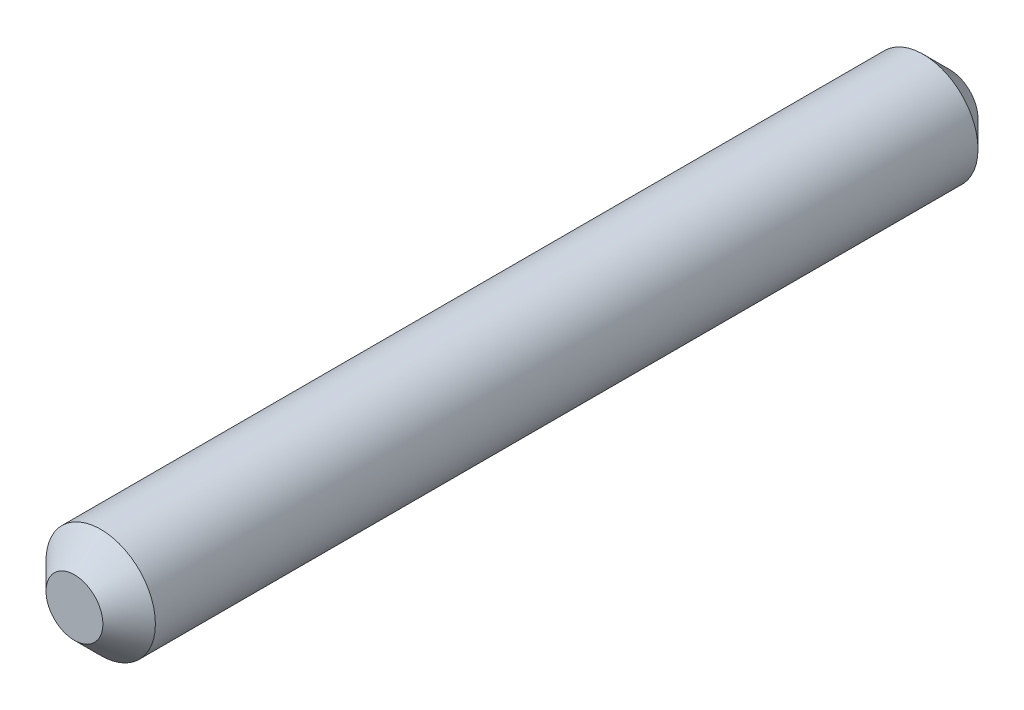
ISO-10303-21;
HEADER;
FILE_DESCRIPTION(('STEP AP214'),'2;1');
FILE_NAME('part.step','',(''),(''),'','','');
FILE_SCHEMA(('AUTOMOTIVE_DESIGN { 1 0 10303 214 1 1 1 1 }'));
ENDSEC;
DATA;
#1=APPLICATION_CONTEXT('core data for automotive mechanical design processes');
#2=APPLICATION_PROTOCOL_DEFINITION('international standard','automotive_design',2000,#1);
#3=PRODUCT_CONTEXT('',#1,'mechanical');
#4=PRODUCT('Part','Part','',(#3));
#5=PRODUCT_RELATED_PRODUCT_CATEGORY('part','',(#4));
#6=PRODUCT_DEFINITION_FORMATION('','',#4);
#7=PRODUCT_DEFINITION_CONTEXT('part definition',#1,'design');
#8=PRODUCT_DEFINITION('design','',#6,#7);
#9=PRODUCT_DEFINITION_SHAPE('','',#8);
#10=(LENGTH_UNIT() NAMED_UNIT(*) SI_UNIT(.MILLI.,.METRE.));
#11=(NAMED_UNIT(*) PLANE_ANGLE_UNIT() SI_UNIT($,.RADIAN.));
#12=(NAMED_UNIT(*) SI_UNIT($,.STERADIAN.) SOLID_ANGLE_UNIT());
#13=UNCERTAINTY_MEASURE_WITH_UNIT(LENGTH_MEASURE(1.E-05),#10,'distance_accuracy_value','');
#14=(GEOMETRIC_REPRESENTATION_CONTEXT(3) GLOBAL_UNCERTAINTY_ASSIGNED_CONTEXT((#13)) GLOBAL_UNIT_ASSIGNED_CONTEXT((#10,
#11,#12)) REPRESENTATION_CONTEXT('',''));
#15=CARTESIAN_POINT('',(0.,0.,0.));
#16=DIRECTION('',(0.,0.,1.));
#17=DIRECTION('',(1.,0.,0.));
#18=AXIS2_PLACEMENT_3D('',#15,#16,#17);
#19=CARTESIAN_POINT('',(0.,0.,25.4));
#20=DIRECTION('',(0.,0.,-1.));
#21=DIRECTION('',(-1.,0.,0.));
#22=AXIS2_PLACEMENT_3D('',#19,#20,#21);
#23=CYLINDRICAL_SURFACE('',#22,1.5875);
#24=CARTESIAN_POINT('',(0.,0.,24.638));
#25=DIRECTION('',(0.,0.,1.));
#26=DIRECTION('',(1.,0.,0.));
#27=AXIS2_PLACEMENT_3D('',#24,#25,#26);
#28=CIRCLE('',#27,1.5875);
#29=CARTESIAN_POINT('',(1.5875,0.,24.638));
#30=VERTEX_POINT('',#29);
#31=EDGE_CURVE('E52',#30,#30,#28,.F.);
#32=ORIENTED_EDGE('',*,*,#31,.T.);
#33=EDGE_LOOP('',(#32));
#34=FACE_BOUND('',#33,.T.);
#35=CARTESIAN_POINT('',(0.,0.,0.762000000000006));
#36=DIRECTION('',(0.,0.,1.));
#37=DIRECTION('',(1.,0.,0.));
#38=AXIS2_PLACEMENT_3D('',#35,#36,#37);
#39=CIRCLE('',#38,1.5875);
#40=CARTESIAN_POINT('',(1.5875,0.,0.762000000000006));
#41=VERTEX_POINT('',#40);
#42=EDGE_CURVE('E57',#41,#41,#39,.T.);
#43=ORIENTED_EDGE('',*,*,#42,.T.);
#44=EDGE_LOOP('',(#43));
#45=FACE_BOUND('',#44,.T.);
#46=ADVANCED_FACE('F43',(#34,#45),#23,.T.);
#47=CARTESIAN_POINT('',(0.,0.,25.4));
#48=DIRECTION('',(0.,0.,1.));
#49=DIRECTION('',(1.,0.,0.));
#50=AXIS2_PLACEMENT_3D('',#47,#48,#49);
#51=PLANE('',#50);
#52=CARTESIAN_POINT('',(0.,0.,25.4));
#53=DIRECTION('',(0.,0.,1.));
#54=DIRECTION('',(1.,0.,0.));
#55=AXIS2_PLACEMENT_3D('',#52,#53,#54);
#56=CIRCLE('',#55,0.825499999999996);
#57=CARTESIAN_POINT('',(0.825499999999996,0.,25.4));
#58=VERTEX_POINT('',#57);
#59=EDGE_CURVE('E62',#58,#58,#56,.T.);
#60=ORIENTED_EDGE('',*,*,#59,.T.);
#61=EDGE_LOOP('',(#60));
#62=FACE_BOUND('',#61,.T.);
#63=ADVANCED_FACE('F69',(#62),#51,.T.);
#64=CARTESIAN_POINT('',(0.,0.,0.));
#65=DIRECTION('',(0.,0.,1.));
#66=DIRECTION('',(1.,0.,0.));
#67=AXIS2_PLACEMENT_3D('',#64,#65,#66);
#68=PLANE('',#67);
#69=CARTESIAN_POINT('',(0.,0.,0.));
#70=DIRECTION('',(0.,0.,1.));
#71=DIRECTION('',(1.,0.,0.));
#72=AXIS2_PLACEMENT_3D('',#69,#70,#71);
#73=CIRCLE('',#72,0.825499999999993);
#74=CARTESIAN_POINT('',(0.825499999999993,0.,0.));
#75=VERTEX_POINT('',#74);
#76=EDGE_CURVE('E10',#75,#75,#73,.F.);
#77=ORIENTED_EDGE('',*,*,#76,.T.);
#78=EDGE_LOOP('',(#77));
#79=FACE_BOUND('',#78,.T.);
#80=ADVANCED_FACE('F73',(#79),#68,.F.);
#81=CARTESIAN_POINT('',(0.,0.,25.4));
#82=DIRECTION('',(0.,0.,-1.));
#83=DIRECTION('',(-1.,0.,0.));
#84=AXIS2_PLACEMENT_3D('',#81,#82,#83);
#85=CONICAL_SURFACE('',#84,0.825499999999996,0.785398163397451);
#86=ORIENTED_EDGE('',*,*,#31,.F.);
#87=EDGE_LOOP('',(#86));
#88=FACE_BOUND('',#87,.T.);
#89=ORIENTED_EDGE('',*,*,#59,.F.);
#90=EDGE_LOOP('',(#89));
#91=FACE_BOUND('',#90,.T.);
#92=ADVANCED_FACE('F71',(#88,#91),#85,.T.);
#93=CARTESIAN_POINT('',(0.,0.,0.762000000000006));
#94=DIRECTION('',(0.,0.,1.));
#95=DIRECTION('',(1.,0.,0.));
#96=AXIS2_PLACEMENT_3D('',#93,#94,#95);
#97=CONICAL_SURFACE('',#96,1.5875,0.785398163397449);
#98=ORIENTED_EDGE('',*,*,#76,.F.);
#99=EDGE_LOOP('',(#98));
#100=FACE_BOUND('',#99,.T.);
#101=ORIENTED_EDGE('',*,*,#42,.F.);
#102=EDGE_LOOP('',(#101));
#103=FACE_BOUND('',#102,.T.);
#104=ADVANCED_FACE('F46',(#100,#103),#97,.T.);
#105=CLOSED_SHELL('',(#46,#63,#80,#92,#104));
#106=MANIFOLD_SOLID_BREP('B2',#105);
#107=ADVANCED_BREP_SHAPE_REPRESENTATION('',(#18,#106),#14);
#108=SHAPE_DEFINITION_REPRESENTATION(#9,#107);
ENDSEC;
END-ISO-10303-21;
